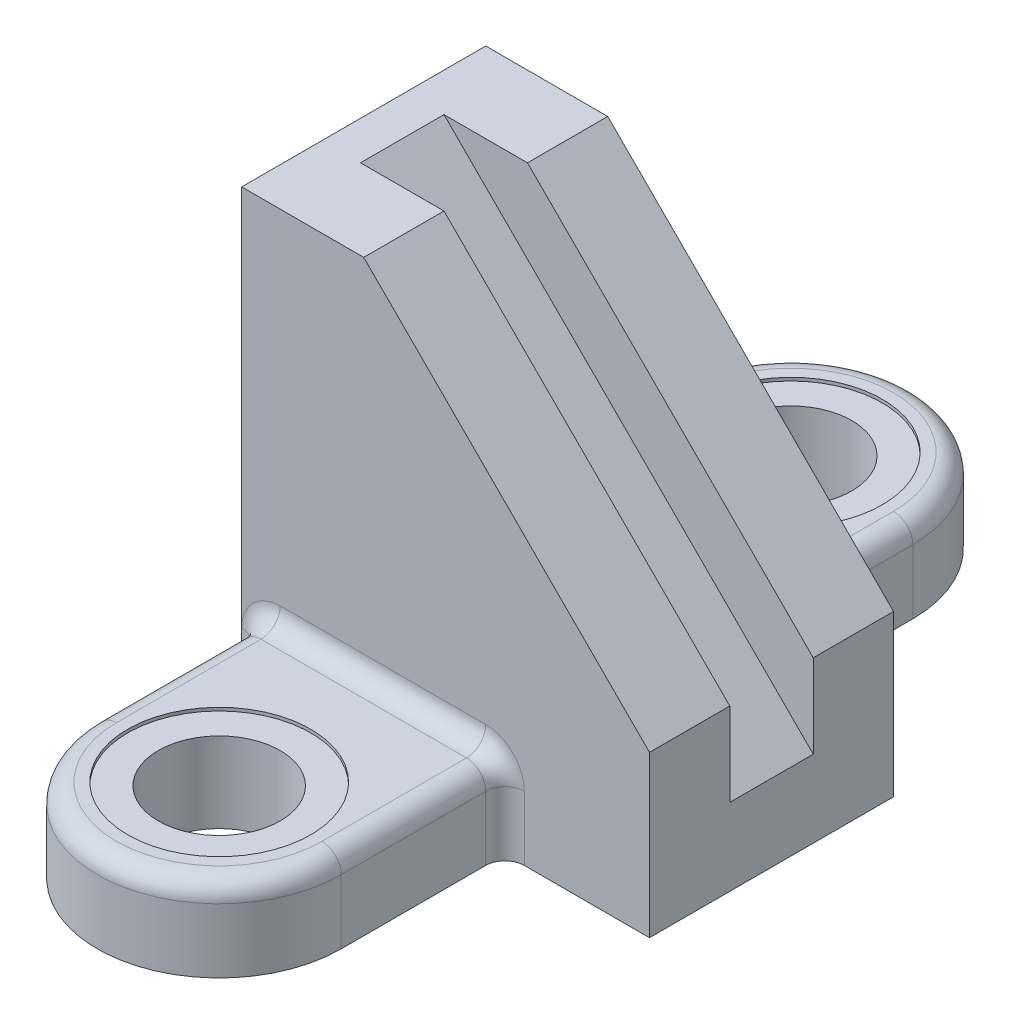
ISO-10303-21;
HEADER;
FILE_DESCRIPTION(('STEP AP214'),'2;1');
FILE_NAME('part.step','',(''),(''),'','','');
FILE_SCHEMA(('AUTOMOTIVE_DESIGN { 1 0 10303 214 1 1 1 1 }'));
ENDSEC;
DATA;
#1=APPLICATION_CONTEXT('core data for automotive mechanical design processes');
#2=APPLICATION_PROTOCOL_DEFINITION('international standard','automotive_design',2000,#1);
#3=PRODUCT_CONTEXT('',#1,'mechanical');
#4=PRODUCT('Part','Part','',(#3));
#5=PRODUCT_RELATED_PRODUCT_CATEGORY('part','',(#4));
#6=PRODUCT_DEFINITION_FORMATION('','',#4);
#7=PRODUCT_DEFINITION_CONTEXT('part definition',#1,'design');
#8=PRODUCT_DEFINITION('design','',#6,#7);
#9=PRODUCT_DEFINITION_SHAPE('','',#8);
#10=(LENGTH_UNIT() NAMED_UNIT(*) SI_UNIT(.MILLI.,.METRE.));
#11=(NAMED_UNIT(*) PLANE_ANGLE_UNIT() SI_UNIT($,.RADIAN.));
#12=(NAMED_UNIT(*) SI_UNIT($,.STERADIAN.) SOLID_ANGLE_UNIT());
#13=UNCERTAINTY_MEASURE_WITH_UNIT(LENGTH_MEASURE(1.E-05),#10,'distance_accuracy_value','');
#14=(GEOMETRIC_REPRESENTATION_CONTEXT(3) GLOBAL_UNCERTAINTY_ASSIGNED_CONTEXT((#13)) GLOBAL_UNIT_ASSIGNED_CONTEXT((#10,
#11,#12)) REPRESENTATION_CONTEXT('',''));
#15=CARTESIAN_POINT('',(0.,0.,0.));
#16=DIRECTION('',(0.,0.,1.));
#17=DIRECTION('',(1.,0.,0.));
#18=AXIS2_PLACEMENT_3D('',#15,#16,#17);
#19=CARTESIAN_POINT('',(0.,0.,38.));
#20=DIRECTION('',(0.,0.,1.));
#21=DIRECTION('',(1.,0.,0.));
#22=AXIS2_PLACEMENT_3D('',#19,#20,#21);
#23=PLANE('',#22);
#24=CARTESIAN_POINT('',(12.,20.,38.));
#25=DIRECTION('',(0.,0.,1.));
#26=DIRECTION('',(1.,0.,0.));
#27=AXIS2_PLACEMENT_3D('',#24,#25,#26);
#28=CIRCLE('',#27,12.);
#29=CARTESIAN_POINT('',(12.,32.,38.));
#30=VERTEX_POINT('',#29);
#31=CARTESIAN_POINT('',(0.,20.,38.));
#32=VERTEX_POINT('',#31);
#33=EDGE_CURVE('E362',#30,#32,#28,.T.);
#34=ORIENTED_EDGE('',*,*,#33,.F.);
#35=DIRECTION('',(1.,0.,0.));
#36=VECTOR('',#35,1.);
#37=CARTESIAN_POINT('',(82.,32.,38.));
#38=LINE('',#37,#36);
#39=CARTESIAN_POINT('',(76.,32.,38.));
#40=VERTEX_POINT('',#39);
#41=EDGE_CURVE('E360',#30,#40,#38,.T.);
#42=ORIENTED_EDGE('',*,*,#41,.T.);
#43=CARTESIAN_POINT('',(76.,20.,38.));
#44=DIRECTION('',(0.,0.,1.));
#45=DIRECTION('',(1.,0.,0.));
#46=AXIS2_PLACEMENT_3D('',#43,#44,#45);
#47=CIRCLE('',#46,12.);
#48=CARTESIAN_POINT('',(88.,20.,38.));
#49=VERTEX_POINT('',#48);
#50=EDGE_CURVE('E357',#49,#40,#47,.T.);
#51=ORIENTED_EDGE('',*,*,#50,.F.);
#52=DIRECTION('',(0.,-1.,0.));
#53=VECTOR('',#52,1.);
#54=CARTESIAN_POINT('',(88.,0.,38.));
#55=LINE('',#54,#53);
#56=CARTESIAN_POINT('',(88.,0.,38.));
#57=VERTEX_POINT('',#56);
#58=EDGE_CURVE('E355',#49,#57,#55,.T.);
#59=ORIENTED_EDGE('',*,*,#58,.T.);
#60=DIRECTION('',(1.,0.,0.));
#61=VECTOR('',#60,1.);
#62=CARTESIAN_POINT('',(0.,0.,38.));
#63=LINE('',#62,#61);
#64=CARTESIAN_POINT('',(127.,0.,38.));
#65=VERTEX_POINT('',#64);
#66=EDGE_CURVE('E296',#57,#65,#63,.T.);
#67=ORIENTED_EDGE('',*,*,#66,.T.);
#68=DIRECTION('',(0.,1.,0.));
#69=VECTOR('',#68,1.);
#70=CARTESIAN_POINT('',(127.,0.,38.));
#71=LINE('',#70,#69);
#72=CARTESIAN_POINT('',(127.,50.,38.));
#73=VERTEX_POINT('',#72);
#74=EDGE_CURVE('E299',#65,#73,#71,.T.);
#75=ORIENTED_EDGE('',*,*,#74,.T.);
#76=DIRECTION('',(-0.707106781186551,0.707106781186544,0.));
#77=VECTOR('',#76,1.);
#78=CARTESIAN_POINT('',(127.,50.,38.));
#79=LINE('',#78,#77);
#80=CARTESIAN_POINT('',(38.,138.999999999999,38.));
#81=VERTEX_POINT('',#80);
#82=EDGE_CURVE('E301',#73,#81,#79,.T.);
#83=ORIENTED_EDGE('',*,*,#82,.T.);
#84=DIRECTION('',(-1.,0.,0.));
#85=VECTOR('',#84,1.);
#86=CARTESIAN_POINT('',(38.,138.999999999999,38.));
#87=LINE('',#86,#85);
#88=CARTESIAN_POINT('',(0.,138.999999999999,38.));
#89=VERTEX_POINT('',#88);
#90=EDGE_CURVE('E303',#81,#89,#87,.T.);
#91=ORIENTED_EDGE('',*,*,#90,.T.);
#92=DIRECTION('',(0.,-1.,0.));
#93=VECTOR('',#92,1.);
#94=CARTESIAN_POINT('',(0.,138.999999999999,38.));
#95=LINE('',#94,#93);
#96=EDGE_CURVE('E293',#89,#32,#95,.T.);
#97=ORIENTED_EDGE('',*,*,#96,.T.);
#98=EDGE_LOOP('',(#34,#42,#51,#59,#67,#75,#83,#91,#97));
#99=FACE_BOUND('',#98,.T.);
#100=ADVANCED_FACE('F37',(#99),#23,.T.);
#101=CARTESIAN_POINT('',(0.,0.,-38.));
#102=DIRECTION('',(0.,0.,1.));
#103=DIRECTION('',(1.,0.,0.));
#104=AXIS2_PLACEMENT_3D('',#101,#102,#103);
#105=PLANE('',#104);
#106=CARTESIAN_POINT('',(12.,20.,-38.));
#107=DIRECTION('',(0.,0.,1.));
#108=DIRECTION('',(1.,0.,0.));
#109=AXIS2_PLACEMENT_3D('',#106,#107,#108);
#110=CIRCLE('',#109,12.);
#111=CARTESIAN_POINT('',(0.,20.,-38.));
#112=VERTEX_POINT('',#111);
#113=CARTESIAN_POINT('',(12.,32.,-38.));
#114=VERTEX_POINT('',#113);
#115=EDGE_CURVE('E344',#112,#114,#110,.F.);
#116=ORIENTED_EDGE('',*,*,#115,.F.);
#117=DIRECTION('',(0.,-1.,0.));
#118=VECTOR('',#117,1.);
#119=CARTESIAN_POINT('',(0.,138.999999999999,-38.));
#120=LINE('',#119,#118);
#121=CARTESIAN_POINT('',(0.,138.999999999999,-38.));
#122=VERTEX_POINT('',#121);
#123=EDGE_CURVE('E306',#122,#112,#120,.T.);
#124=ORIENTED_EDGE('',*,*,#123,.F.);
#125=DIRECTION('',(-1.,0.,0.));
#126=VECTOR('',#125,1.);
#127=CARTESIAN_POINT('',(38.,138.999999999999,-38.));
#128=LINE('',#127,#126);
#129=CARTESIAN_POINT('',(38.,138.999999999999,-38.));
#130=VERTEX_POINT('',#129);
#131=EDGE_CURVE('E317',#130,#122,#128,.T.);
#132=ORIENTED_EDGE('',*,*,#131,.F.);
#133=DIRECTION('',(-0.707106781186551,0.707106781186544,0.));
#134=VECTOR('',#133,1.);
#135=CARTESIAN_POINT('',(127.,50.,-38.));
#136=LINE('',#135,#134);
#137=CARTESIAN_POINT('',(127.,50.,-38.));
#138=VERTEX_POINT('',#137);
#139=EDGE_CURVE('E314',#138,#130,#136,.T.);
#140=ORIENTED_EDGE('',*,*,#139,.F.);
#141=DIRECTION('',(0.,1.,0.));
#142=VECTOR('',#141,1.);
#143=CARTESIAN_POINT('',(127.,0.,-38.));
#144=LINE('',#143,#142);
#145=CARTESIAN_POINT('',(127.,0.,-38.));
#146=VERTEX_POINT('',#145);
#147=EDGE_CURVE('E311',#146,#138,#144,.T.);
#148=ORIENTED_EDGE('',*,*,#147,.F.);
#149=DIRECTION('',(1.,0.,0.));
#150=VECTOR('',#149,1.);
#151=CARTESIAN_POINT('',(0.,0.,-38.));
#152=LINE('',#151,#150);
#153=CARTESIAN_POINT('',(88.,0.,-38.));
#154=VERTEX_POINT('',#153);
#155=EDGE_CURVE('E309',#154,#146,#152,.T.);
#156=ORIENTED_EDGE('',*,*,#155,.F.);
#157=DIRECTION('',(0.,-1.,0.));
#158=VECTOR('',#157,1.);
#159=CARTESIAN_POINT('',(88.,26.,-38.));
#160=LINE('',#159,#158);
#161=CARTESIAN_POINT('',(88.,20.,-38.));
#162=VERTEX_POINT('',#161);
#163=EDGE_CURVE('E340',#154,#162,#160,.F.);
#164=ORIENTED_EDGE('',*,*,#163,.T.);
#165=CARTESIAN_POINT('',(76.,20.,-38.));
#166=DIRECTION('',(0.,0.,1.));
#167=DIRECTION('',(1.,0.,0.));
#168=AXIS2_PLACEMENT_3D('',#165,#166,#167);
#169=CIRCLE('',#168,12.);
#170=CARTESIAN_POINT('',(76.,32.,-38.));
#171=VERTEX_POINT('',#170);
#172=EDGE_CURVE('E337',#171,#162,#169,.F.);
#173=ORIENTED_EDGE('',*,*,#172,.F.);
#174=DIRECTION('',(1.,0.,0.));
#175=VECTOR('',#174,1.);
#176=CARTESIAN_POINT('',(0.,32.,-38.));
#177=LINE('',#176,#175);
#178=EDGE_CURVE('E342',#171,#114,#177,.F.);
#179=ORIENTED_EDGE('',*,*,#178,.T.);
#180=EDGE_LOOP('',(#116,#124,#132,#140,#148,#156,#164,#173,#179));
#181=FACE_BOUND('',#180,.T.);
#182=ADVANCED_FACE('F522',(#181),#105,.F.);
#183=CARTESIAN_POINT('',(127.,50.,38.));
#184=DIRECTION('',(-0.707106781186544,-0.707106781186551,0.));
#185=DIRECTION('',(0.707106781186551,-0.707106781186544,0.));
#186=AXIS2_PLACEMENT_3D('',#183,#184,#185);
#187=PLANE('',#186);
#188=DIRECTION('',(0.,0.,-1.));
#189=VECTOR('',#188,1.);
#190=CARTESIAN_POINT('',(38.,138.999999999999,38.));
#191=LINE('',#190,#189);
#192=CARTESIAN_POINT('',(38.,138.999999999999,-13.));
#193=VERTEX_POINT('',#192);
#194=EDGE_CURVE('E321',#193,#130,#191,.T.);
#195=ORIENTED_EDGE('',*,*,#194,.F.);
#196=DIRECTION('',(0.707106781186551,-0.707106781186544,0.));
#197=VECTOR('',#196,1.);
#198=CARTESIAN_POINT('',(127.,50.,-13.));
#199=LINE('',#198,#197);
#200=CARTESIAN_POINT('',(127.,50.,-13.));
#201=VERTEX_POINT('',#200);
#202=EDGE_CURVE('E283',#193,#201,#199,.T.);
#203=ORIENTED_EDGE('',*,*,#202,.T.);
#204=DIRECTION('',(0.,0.,-1.));
#205=VECTOR('',#204,1.);
#206=CARTESIAN_POINT('',(127.,50.,38.));
#207=LINE('',#206,#205);
#208=EDGE_CURVE('E325',#201,#138,#207,.T.);
#209=ORIENTED_EDGE('',*,*,#208,.T.);
#210=ORIENTED_EDGE('',*,*,#139,.T.);
#211=EDGE_LOOP('',(#195,#203,#209,#210));
#212=FACE_BOUND('',#211,.T.);
#213=ADVANCED_FACE('F527',(#212),#187,.F.);
#214=CARTESIAN_POINT('',(0.,138.999999999999,38.));
#215=DIRECTION('',(1.,0.,0.));
#216=DIRECTION('',(0.,0.,-1.));
#217=AXIS2_PLACEMENT_3D('',#214,#215,#216);
#218=PLANE('',#217);
#219=ORIENTED_EDGE('',*,*,#123,.T.);
#220=CARTESIAN_POINT('',(0.,0.,-38.));
#221=VERTEX_POINT('',#220);
#222=EDGE_CURVE('E292',#112,#221,#120,.T.);
#223=ORIENTED_EDGE('',*,*,#222,.T.);
#224=DIRECTION('',(0.,0.,-1.));
#225=VECTOR('',#224,1.);
#226=CARTESIAN_POINT('',(0.,0.,38.));
#227=LINE('',#226,#225);
#228=CARTESIAN_POINT('',(0.,0.,38.));
#229=VERTEX_POINT('',#228);
#230=EDGE_CURVE('E332',#229,#221,#227,.T.);
#231=ORIENTED_EDGE('',*,*,#230,.F.);
#232=EDGE_CURVE('E297',#32,#229,#95,.T.);
#233=ORIENTED_EDGE('',*,*,#232,.F.);
#234=ORIENTED_EDGE('',*,*,#96,.F.);
#235=DIRECTION('',(0.,0.,-1.));
#236=VECTOR('',#235,1.);
#237=CARTESIAN_POINT('',(0.,138.999999999999,38.));
#238=LINE('',#237,#236);
#239=EDGE_CURVE('E305',#89,#122,#238,.T.);
#240=ORIENTED_EDGE('',*,*,#239,.T.);
#241=EDGE_LOOP('',(#219,#223,#231,#233,#234,#240));
#242=FACE_BOUND('',#241,.T.);
#243=ADVANCED_FACE('F471',(#242),#218,.F.);
#244=CARTESIAN_POINT('',(0.,0.,38.));
#245=DIRECTION('',(0.,1.,0.));
#246=DIRECTION('',(0.,0.,1.));
#247=AXIS2_PLACEMENT_3D('',#244,#245,#246);
#248=PLANE('',#247);
#249=CARTESIAN_POINT('',(44.,0.,-89.));
#250=DIRECTION('',(0.,1.,0.));
#251=DIRECTION('',(0.,0.,1.));
#252=AXIS2_PLACEMENT_3D('',#249,#250,#251);
#253=CIRCLE('',#252,19.);
#254=CARTESIAN_POINT('',(44.,0.,-70.));
#255=VERTEX_POINT('',#254);
#256=EDGE_CURVE('E234',#255,#255,#253,.T.);
#257=ORIENTED_EDGE('',*,*,#256,.T.);
#258=EDGE_LOOP('',(#257));
#259=FACE_BOUND('',#258,.T.);
#260=CARTESIAN_POINT('',(44.,0.,89.));
#261=DIRECTION('',(0.,1.,0.));
#262=DIRECTION('',(0.,0.,1.));
#263=AXIS2_PLACEMENT_3D('',#260,#261,#262);
#264=CIRCLE('',#263,19.);
#265=CARTESIAN_POINT('',(44.,0.,108.));
#266=VERTEX_POINT('',#265);
#267=EDGE_CURVE('E252',#266,#266,#264,.T.);
#268=ORIENTED_EDGE('',*,*,#267,.T.);
#269=EDGE_LOOP('',(#268));
#270=FACE_BOUND('',#269,.T.);
#271=ORIENTED_EDGE('',*,*,#230,.T.);
#272=CARTESIAN_POINT('',(0.,0.,-44.));
#273=DIRECTION('',(0.,1.,0.));
#274=DIRECTION('',(0.,0.,1.));
#275=AXIS2_PLACEMENT_3D('',#272,#273,#274);
#276=CIRCLE('',#275,6.);
#277=CARTESIAN_POINT('',(6.,0.,-44.));
#278=VERTEX_POINT('',#277);
#279=EDGE_CURVE('E233',#221,#278,#276,.T.);
#280=ORIENTED_EDGE('',*,*,#279,.T.);
#281=DIRECTION('',(0.,0.,1.));
#282=VECTOR('',#281,1.);
#283=CARTESIAN_POINT('',(6.,0.,-38.));
#284=LINE('',#283,#282);
#285=CARTESIAN_POINT('',(5.99999999999999,0.,-89.));
#286=VERTEX_POINT('',#285);
#287=EDGE_CURVE('E215',#286,#278,#284,.T.);
#288=ORIENTED_EDGE('',*,*,#287,.F.);
#289=CARTESIAN_POINT('',(44.,0.,-89.));
#290=DIRECTION('',(0.,1.,0.));
#291=DIRECTION('',(0.,0.,-1.));
#292=AXIS2_PLACEMENT_3D('',#289,#290,#291);
#293=CIRCLE('',#292,38.);
#294=CARTESIAN_POINT('',(82.,0.,-89.));
#295=VERTEX_POINT('',#294);
#296=EDGE_CURVE('E226',#295,#286,#293,.T.);
#297=ORIENTED_EDGE('',*,*,#296,.F.);
#298=DIRECTION('',(0.,0.,-1.));
#299=VECTOR('',#298,1.);
#300=CARTESIAN_POINT('',(82.,0.,-38.));
#301=LINE('',#300,#299);
#302=CARTESIAN_POINT('',(82.,0.,-44.));
#303=VERTEX_POINT('',#302);
#304=EDGE_CURVE('E222',#303,#295,#301,.T.);
#305=ORIENTED_EDGE('',*,*,#304,.F.);
#306=CARTESIAN_POINT('',(88.,0.,-44.));
#307=DIRECTION('',(0.,1.,0.));
#308=DIRECTION('',(0.,0.,1.));
#309=AXIS2_PLACEMENT_3D('',#306,#307,#308);
#310=CIRCLE('',#309,6.);
#311=EDGE_CURVE('E46',#303,#154,#310,.T.);
#312=ORIENTED_EDGE('',*,*,#311,.T.);
#313=ORIENTED_EDGE('',*,*,#155,.T.);
#314=DIRECTION('',(0.,0.,-1.));
#315=VECTOR('',#314,1.);
#316=CARTESIAN_POINT('',(127.,0.,38.));
#317=LINE('',#316,#315);
#318=EDGE_CURVE('E329',#65,#146,#317,.T.);
#319=ORIENTED_EDGE('',*,*,#318,.F.);
#320=ORIENTED_EDGE('',*,*,#66,.F.);
#321=CARTESIAN_POINT('',(88.,0.,44.));
#322=DIRECTION('',(0.,1.,0.));
#323=DIRECTION('',(0.,0.,1.));
#324=AXIS2_PLACEMENT_3D('',#321,#322,#323);
#325=CIRCLE('',#324,6.);
#326=CARTESIAN_POINT('',(82.,0.,44.));
#327=VERTEX_POINT('',#326);
#328=EDGE_CURVE('E11',#57,#327,#325,.T.);
#329=ORIENTED_EDGE('',*,*,#328,.T.);
#330=DIRECTION('',(0.,0.,1.));
#331=VECTOR('',#330,1.);
#332=CARTESIAN_POINT('',(82.,0.,38.));
#333=LINE('',#332,#331);
#334=CARTESIAN_POINT('',(82.,0.,89.));
#335=VERTEX_POINT('',#334);
#336=EDGE_CURVE('E258',#327,#335,#333,.T.);
#337=ORIENTED_EDGE('',*,*,#336,.T.);
#338=CARTESIAN_POINT('',(44.,0.,89.));
#339=DIRECTION('',(0.,-1.,0.));
#340=DIRECTION('',(0.,0.,1.));
#341=AXIS2_PLACEMENT_3D('',#338,#339,#340);
#342=CIRCLE('',#341,38.);
#343=CARTESIAN_POINT('',(5.99999999999999,0.,89.));
#344=VERTEX_POINT('',#343);
#345=EDGE_CURVE('E260',#335,#344,#342,.T.);
#346=ORIENTED_EDGE('',*,*,#345,.T.);
#347=DIRECTION('',(0.,0.,-1.));
#348=VECTOR('',#347,1.);
#349=CARTESIAN_POINT('',(6.,0.,38.));
#350=LINE('',#349,#348);
#351=CARTESIAN_POINT('',(6.,0.,44.));
#352=VERTEX_POINT('',#351);
#353=EDGE_CURVE('E255',#344,#352,#350,.T.);
#354=ORIENTED_EDGE('',*,*,#353,.T.);
#355=CARTESIAN_POINT('',(0.,0.,44.));
#356=DIRECTION('',(0.,1.,0.));
#357=DIRECTION('',(0.,0.,1.));
#358=AXIS2_PLACEMENT_3D('',#355,#356,#357);
#359=CIRCLE('',#358,6.);
#360=EDGE_CURVE('E395',#352,#229,#359,.T.);
#361=ORIENTED_EDGE('',*,*,#360,.T.);
#362=EDGE_LOOP('',(#271,#280,#288,#297,#305,#312,#313,#319,#320,#329,#337,#346,#354,#361));
#363=FACE_BOUND('',#362,.T.);
#364=ADVANCED_FACE('F232',(#259,#270,#363),#248,.F.);
#365=CARTESIAN_POINT('',(127.,0.,38.));
#366=DIRECTION('',(-1.,0.,0.));
#367=DIRECTION('',(0.,0.,1.));
#368=AXIS2_PLACEMENT_3D('',#365,#366,#367);
#369=PLANE('',#368);
#370=ORIENTED_EDGE('',*,*,#208,.F.);
#371=DIRECTION('',(0.,-1.,0.));
#372=VECTOR('',#371,1.);
#373=CARTESIAN_POINT('',(127.,0.,-13.));
#374=LINE('',#373,#372);
#375=CARTESIAN_POINT('',(127.,24.0000000000003,-13.));
#376=VERTEX_POINT('',#375);
#377=EDGE_CURVE('E286',#201,#376,#374,.T.);
#378=ORIENTED_EDGE('',*,*,#377,.T.);
#379=DIRECTION('',(0.,0.,1.));
#380=VECTOR('',#379,1.);
#381=CARTESIAN_POINT('',(127.,24.0000000000003,38.));
#382=LINE('',#381,#380);
#383=CARTESIAN_POINT('',(127.,24.0000000000003,13.));
#384=VERTEX_POINT('',#383);
#385=EDGE_CURVE('E289',#376,#384,#382,.T.);
#386=ORIENTED_EDGE('',*,*,#385,.T.);
#387=DIRECTION('',(0.,1.,0.));
#388=VECTOR('',#387,1.);
#389=CARTESIAN_POINT('',(127.,0.,13.));
#390=LINE('',#389,#388);
#391=CARTESIAN_POINT('',(127.,50.,13.));
#392=VERTEX_POINT('',#391);
#393=EDGE_CURVE('E280',#384,#392,#390,.T.);
#394=ORIENTED_EDGE('',*,*,#393,.T.);
#395=EDGE_CURVE('E326',#73,#392,#207,.T.);
#396=ORIENTED_EDGE('',*,*,#395,.F.);
#397=ORIENTED_EDGE('',*,*,#74,.F.);
#398=ORIENTED_EDGE('',*,*,#318,.T.);
#399=ORIENTED_EDGE('',*,*,#147,.T.);
#400=EDGE_LOOP('',(#370,#378,#386,#394,#396,#397,#398,#399));
#401=FACE_BOUND('',#400,.T.);
#402=ADVANCED_FACE('F456',(#401),#369,.F.);
#403=ORIENTED_EDGE('',*,*,#395,.T.);
#404=DIRECTION('',(-0.707106781186551,0.707106781186544,0.));
#405=VECTOR('',#404,1.);
#406=CARTESIAN_POINT('',(127.,50.,13.));
#407=LINE('',#406,#405);
#408=CARTESIAN_POINT('',(38.,138.999999999999,13.));
#409=VERTEX_POINT('',#408);
#410=EDGE_CURVE('E275',#392,#409,#407,.T.);
#411=ORIENTED_EDGE('',*,*,#410,.T.);
#412=EDGE_CURVE('E322',#81,#409,#191,.T.);
#413=ORIENTED_EDGE('',*,*,#412,.F.);
#414=ORIENTED_EDGE('',*,*,#82,.F.);
#415=EDGE_LOOP('',(#403,#411,#413,#414));
#416=FACE_BOUND('',#415,.T.);
#417=ADVANCED_FACE('F462',(#416),#187,.F.);
#418=CARTESIAN_POINT('',(38.,138.999999999999,38.));
#419=DIRECTION('',(0.,-1.,0.));
#420=DIRECTION('',(0.,0.,-1.));
#421=AXIS2_PLACEMENT_3D('',#418,#419,#420);
#422=PLANE('',#421);
#423=DIRECTION('',(0.,0.,1.));
#424=VECTOR('',#423,1.);
#425=CARTESIAN_POINT('',(12.,138.999999999999,13.));
#426=LINE('',#425,#424);
#427=CARTESIAN_POINT('',(12.,138.999999999999,-13.));
#428=VERTEX_POINT('',#427);
#429=CARTESIAN_POINT('',(12.,138.999999999999,13.));
#430=VERTEX_POINT('',#429);
#431=EDGE_CURVE('E266',#428,#430,#426,.T.);
#432=ORIENTED_EDGE('',*,*,#431,.F.);
#433=DIRECTION('',(1.,0.,0.));
#434=VECTOR('',#433,1.);
#435=CARTESIAN_POINT('',(38.,138.999999999999,-13.));
#436=LINE('',#435,#434);
#437=EDGE_CURVE('E334',#428,#193,#436,.T.);
#438=ORIENTED_EDGE('',*,*,#437,.T.);
#439=ORIENTED_EDGE('',*,*,#194,.T.);
#440=ORIENTED_EDGE('',*,*,#131,.T.);
#441=ORIENTED_EDGE('',*,*,#239,.F.);
#442=ORIENTED_EDGE('',*,*,#90,.F.);
#443=ORIENTED_EDGE('',*,*,#412,.T.);
#444=DIRECTION('',(1.,0.,0.));
#445=VECTOR('',#444,1.);
#446=CARTESIAN_POINT('',(64.,138.999999999999,13.));
#447=LINE('',#446,#445);
#448=EDGE_CURVE('E270',#430,#409,#447,.T.);
#449=ORIENTED_EDGE('',*,*,#448,.F.);
#450=EDGE_LOOP('',(#432,#438,#439,#440,#441,#442,#443,#449));
#451=FACE_BOUND('',#450,.T.);
#452=ADVANCED_FACE('F466',(#451),#422,.F.);
#453=CARTESIAN_POINT('',(139.,12.0000000000003,13.));
#454=DIRECTION('',(-0.707106781186544,-0.707106781186551,0.));
#455=DIRECTION('',(0.707106781186551,-0.707106781186544,0.));
#456=AXIS2_PLACEMENT_3D('',#453,#454,#455);
#457=PLANE('',#456);
#458=DIRECTION('',(-0.707106781186551,0.707106781186544,0.));
#459=VECTOR('',#458,1.);
#460=CARTESIAN_POINT('',(139.,12.0000000000003,-13.));
#461=LINE('',#460,#459);
#462=EDGE_CURVE('E273',#376,#428,#461,.T.);
#463=ORIENTED_EDGE('',*,*,#462,.T.);
#464=ORIENTED_EDGE('',*,*,#431,.T.);
#465=DIRECTION('',(-0.707106781186551,0.707106781186544,0.));
#466=VECTOR('',#465,1.);
#467=CARTESIAN_POINT('',(139.,12.0000000000003,13.));
#468=LINE('',#467,#466);
#469=EDGE_CURVE('E272',#384,#430,#468,.T.);
#470=ORIENTED_EDGE('',*,*,#469,.F.);
#471=ORIENTED_EDGE('',*,*,#385,.F.);
#472=EDGE_LOOP('',(#463,#464,#470,#471));
#473=FACE_BOUND('',#472,.T.);
#474=ADVANCED_FACE('F531',(#473),#457,.F.);
#475=CARTESIAN_POINT('',(191.,12.0000000000003,-13.));
#476=DIRECTION('',(0.,0.,-1.));
#477=DIRECTION('',(0.,1.,0.));
#478=AXIS2_PLACEMENT_3D('',#475,#476,#477);
#479=PLANE('',#478);
#480=ORIENTED_EDGE('',*,*,#202,.F.);
#481=ORIENTED_EDGE('',*,*,#437,.F.);
#482=ORIENTED_EDGE('',*,*,#462,.F.);
#483=ORIENTED_EDGE('',*,*,#377,.F.);
#484=EDGE_LOOP('',(#480,#481,#482,#483));
#485=FACE_BOUND('',#484,.T.);
#486=ADVANCED_FACE('F850',(#485),#479,.F.);
#487=CARTESIAN_POINT('',(191.,12.0000000000003,13.));
#488=DIRECTION('',(0.,0.,1.));
#489=DIRECTION('',(0.,-1.,0.));
#490=AXIS2_PLACEMENT_3D('',#487,#488,#489);
#491=PLANE('',#490);
#492=ORIENTED_EDGE('',*,*,#469,.T.);
#493=ORIENTED_EDGE('',*,*,#448,.T.);
#494=ORIENTED_EDGE('',*,*,#410,.F.);
#495=ORIENTED_EDGE('',*,*,#393,.F.);
#496=EDGE_LOOP('',(#492,#493,#494,#495));
#497=FACE_BOUND('',#496,.T.);
#498=ADVANCED_FACE('F725',(#497),#491,.F.);
#499=CARTESIAN_POINT('',(6.,26.,38.));
#500=DIRECTION('',(-1.,0.,0.));
#501=DIRECTION('',(0.,0.,1.));
#502=AXIS2_PLACEMENT_3D('',#499,#500,#501);
#503=PLANE('',#502);
#504=DIRECTION('',(0.,0.,-1.));
#505=VECTOR('',#504,1.);
#506=CARTESIAN_POINT('',(6.,20.,38.));
#507=LINE('',#506,#505);
#508=CARTESIAN_POINT('',(5.99999999999999,20.,89.));
#509=VERTEX_POINT('',#508);
#510=CARTESIAN_POINT('',(6.,20.,44.));
#511=VERTEX_POINT('',#510);
#512=EDGE_CURVE('E350',#509,#511,#507,.T.);
#513=ORIENTED_EDGE('',*,*,#512,.T.);
#514=DIRECTION('',(0.,-1.,0.));
#515=VECTOR('',#514,1.);
#516=CARTESIAN_POINT('',(6.,0.,44.));
#517=LINE('',#516,#515);
#518=EDGE_CURVE('E352',#511,#352,#517,.T.);
#519=ORIENTED_EDGE('',*,*,#518,.T.);
#520=ORIENTED_EDGE('',*,*,#353,.F.);
#521=DIRECTION('',(0.,-1.,0.));
#522=VECTOR('',#521,1.);
#523=CARTESIAN_POINT('',(5.99999999999999,26.,89.));
#524=LINE('',#523,#522);
#525=EDGE_CURVE('E264',#509,#344,#524,.T.);
#526=ORIENTED_EDGE('',*,*,#525,.F.);
#527=EDGE_LOOP('',(#513,#519,#520,#526));
#528=FACE_BOUND('',#527,.T.);
#529=ADVANCED_FACE('F484',(#528),#503,.T.);
#530=CARTESIAN_POINT('',(44.,26.,89.));
#531=DIRECTION('',(0.,-1.,0.));
#532=DIRECTION('',(0.,0.,-1.));
#533=AXIS2_PLACEMENT_3D('',#530,#531,#532);
#534=CYLINDRICAL_SURFACE('',#533,38.);
#535=DIRECTION('',(0.,-1.,0.));
#536=VECTOR('',#535,1.);
#537=CARTESIAN_POINT('',(82.,26.,89.));
#538=LINE('',#537,#536);
#539=CARTESIAN_POINT('',(82.,20.,89.));
#540=VERTEX_POINT('',#539);
#541=EDGE_CURVE('E263',#540,#335,#538,.T.);
#542=ORIENTED_EDGE('',*,*,#541,.F.);
#543=CARTESIAN_POINT('',(44.,20.,89.));
#544=DIRECTION('',(0.,1.,0.));
#545=DIRECTION('',(0.,0.,1.));
#546=AXIS2_PLACEMENT_3D('',#543,#544,#545);
#547=CIRCLE('',#546,38.);
#548=EDGE_CURVE('E385',#540,#509,#547,.F.);
#549=ORIENTED_EDGE('',*,*,#548,.T.);
#550=ORIENTED_EDGE('',*,*,#525,.T.);
#551=ORIENTED_EDGE('',*,*,#345,.F.);
#552=EDGE_LOOP('',(#542,#549,#550,#551));
#553=FACE_BOUND('',#552,.T.);
#554=ADVANCED_FACE('F491',(#553),#534,.T.);
#555=CARTESIAN_POINT('',(82.,26.,38.));
#556=DIRECTION('',(1.,0.,0.));
#557=DIRECTION('',(0.,0.,-1.));
#558=AXIS2_PLACEMENT_3D('',#555,#556,#557);
#559=PLANE('',#558);
#560=DIRECTION('',(0.,-1.,0.));
#561=VECTOR('',#560,1.);
#562=CARTESIAN_POINT('',(82.,26.,44.));
#563=LINE('',#562,#561);
#564=CARTESIAN_POINT('',(82.,20.,44.));
#565=VERTEX_POINT('',#564);
#566=EDGE_CURVE('E54',#327,#565,#563,.F.);
#567=ORIENTED_EDGE('',*,*,#566,.T.);
#568=DIRECTION('',(0.,0.,1.));
#569=VECTOR('',#568,1.);
#570=CARTESIAN_POINT('',(82.,20.,38.));
#571=LINE('',#570,#569);
#572=EDGE_CURVE('E392',#565,#540,#571,.T.);
#573=ORIENTED_EDGE('',*,*,#572,.T.);
#574=ORIENTED_EDGE('',*,*,#541,.T.);
#575=ORIENTED_EDGE('',*,*,#336,.F.);
#576=EDGE_LOOP('',(#567,#573,#574,#575));
#577=FACE_BOUND('',#576,.T.);
#578=ADVANCED_FACE('F510',(#577),#559,.T.);
#579=CARTESIAN_POINT('',(44.,26.,89.));
#580=DIRECTION('',(0.,1.,0.));
#581=DIRECTION('',(0.,0.,1.));
#582=AXIS2_PLACEMENT_3D('',#579,#580,#581);
#583=PLANE('',#582);
#584=DIRECTION('',(0.,0.,1.));
#585=VECTOR('',#584,1.);
#586=CARTESIAN_POINT('',(76.,26.,89.));
#587=LINE('',#586,#585);
#588=CARTESIAN_POINT('',(76.,26.,89.));
#589=VERTEX_POINT('',#588);
#590=CARTESIAN_POINT('',(76.,26.,44.));
#591=VERTEX_POINT('',#590);
#592=EDGE_CURVE('E374',#589,#591,#587,.F.);
#593=ORIENTED_EDGE('',*,*,#592,.T.);
#594=DIRECTION('',(1.,0.,0.));
#595=VECTOR('',#594,1.);
#596=CARTESIAN_POINT('',(6.,26.,44.));
#597=LINE('',#596,#595);
#598=CARTESIAN_POINT('',(12.,26.,44.));
#599=VERTEX_POINT('',#598);
#600=EDGE_CURVE('E380',#591,#599,#597,.F.);
#601=ORIENTED_EDGE('',*,*,#600,.T.);
#602=DIRECTION('',(0.,0.,-1.));
#603=VECTOR('',#602,1.);
#604=CARTESIAN_POINT('',(12.,26.,89.));
#605=LINE('',#604,#603);
#606=CARTESIAN_POINT('',(12.,26.,89.));
#607=VERTEX_POINT('',#606);
#608=EDGE_CURVE('E378',#599,#607,#605,.F.);
#609=ORIENTED_EDGE('',*,*,#608,.T.);
#610=CARTESIAN_POINT('',(44.,26.,89.));
#611=DIRECTION('',(0.,1.,0.));
#612=DIRECTION('',(0.,0.,1.));
#613=AXIS2_PLACEMENT_3D('',#610,#611,#612);
#614=CIRCLE('',#613,32.);
#615=EDGE_CURVE('E376',#607,#589,#614,.T.);
#616=ORIENTED_EDGE('',*,*,#615,.T.);
#617=EDGE_LOOP('',(#593,#601,#609,#616));
#618=FACE_BOUND('',#617,.T.);
#619=CARTESIAN_POINT('',(44.,26.,89.));
#620=DIRECTION('',(0.,1.,0.));
#621=DIRECTION('',(0.,0.,1.));
#622=AXIS2_PLACEMENT_3D('',#619,#620,#621);
#623=CIRCLE('',#622,28.5);
#624=CARTESIAN_POINT('',(44.,26.,117.5));
#625=VERTEX_POINT('',#624);
#626=EDGE_CURVE('E242',#625,#625,#623,.T.);
#627=ORIENTED_EDGE('',*,*,#626,.F.);
#628=EDGE_LOOP('',(#627));
#629=FACE_BOUND('',#628,.T.);
#630=ADVANCED_FACE('F505',(#618,#629),#583,.T.);
#631=CARTESIAN_POINT('',(44.,26.,89.));
#632=DIRECTION('',(0.,1.,0.));
#633=DIRECTION('',(0.,0.,1.));
#634=AXIS2_PLACEMENT_3D('',#631,#632,#633);
#635=CYLINDRICAL_SURFACE('',#634,19.);
#636=ORIENTED_EDGE('',*,*,#267,.F.);
#637=EDGE_LOOP('',(#636));
#638=FACE_BOUND('',#637,.T.);
#639=CARTESIAN_POINT('',(44.,25.,89.));
#640=DIRECTION('',(0.,1.,0.));
#641=DIRECTION('',(0.,0.,1.));
#642=AXIS2_PLACEMENT_3D('',#639,#640,#641);
#643=CIRCLE('',#642,19.);
#644=CARTESIAN_POINT('',(44.,25.,108.));
#645=VERTEX_POINT('',#644);
#646=EDGE_CURVE('E249',#645,#645,#643,.T.);
#647=ORIENTED_EDGE('',*,*,#646,.T.);
#648=EDGE_LOOP('',(#647));
#649=FACE_BOUND('',#648,.T.);
#650=ADVANCED_FACE('F517',(#638,#649),#635,.F.);
#651=CARTESIAN_POINT('',(63.,25.,89.));
#652=DIRECTION('',(0.,-1.,0.));
#653=DIRECTION('',(0.,0.,-1.));
#654=AXIS2_PLACEMENT_3D('',#651,#652,#653);
#655=PLANE('',#654);
#656=ORIENTED_EDGE('',*,*,#646,.F.);
#657=EDGE_LOOP('',(#656));
#658=FACE_BOUND('',#657,.T.);
#659=CARTESIAN_POINT('',(44.,25.,89.));
#660=DIRECTION('',(0.,1.,0.));
#661=DIRECTION('',(0.,0.,1.));
#662=AXIS2_PLACEMENT_3D('',#659,#660,#661);
#663=CIRCLE('',#662,28.5);
#664=CARTESIAN_POINT('',(44.,25.,117.5));
#665=VERTEX_POINT('',#664);
#666=EDGE_CURVE('E246',#665,#665,#663,.T.);
#667=ORIENTED_EDGE('',*,*,#666,.T.);
#668=EDGE_LOOP('',(#667));
#669=FACE_BOUND('',#668,.T.);
#670=ADVANCED_FACE('F686',(#658,#669),#655,.F.);
#671=CARTESIAN_POINT('',(44.,26.,89.));
#672=DIRECTION('',(0.,1.,0.));
#673=DIRECTION('',(0.,0.,1.));
#674=AXIS2_PLACEMENT_3D('',#671,#672,#673);
#675=CYLINDRICAL_SURFACE('',#674,28.5);
#676=ORIENTED_EDGE('',*,*,#666,.F.);
#677=EDGE_LOOP('',(#676));
#678=FACE_BOUND('',#677,.T.);
#679=ORIENTED_EDGE('',*,*,#626,.T.);
#680=EDGE_LOOP('',(#679));
#681=FACE_BOUND('',#680,.T.);
#682=ADVANCED_FACE('F679',(#678,#681),#675,.F.);
#683=CARTESIAN_POINT('',(6.,26.,-38.));
#684=DIRECTION('',(1.,0.,0.));
#685=DIRECTION('',(0.,0.,-1.));
#686=AXIS2_PLACEMENT_3D('',#683,#684,#685);
#687=PLANE('',#686);
#688=ORIENTED_EDGE('',*,*,#287,.T.);
#689=DIRECTION('',(0.,-1.,0.));
#690=VECTOR('',#689,1.);
#691=CARTESIAN_POINT('',(6.,26.,-44.));
#692=LINE('',#691,#690);
#693=CARTESIAN_POINT('',(6.,20.,-44.));
#694=VERTEX_POINT('',#693);
#695=EDGE_CURVE('E348',#278,#694,#692,.F.);
#696=ORIENTED_EDGE('',*,*,#695,.T.);
#697=DIRECTION('',(0.,0.,1.));
#698=VECTOR('',#697,1.);
#699=CARTESIAN_POINT('',(6.,20.,-89.));
#700=LINE('',#699,#698);
#701=CARTESIAN_POINT('',(5.99999999999999,20.,-89.));
#702=VERTEX_POINT('',#701);
#703=EDGE_CURVE('E218',#694,#702,#700,.F.);
#704=ORIENTED_EDGE('',*,*,#703,.T.);
#705=DIRECTION('',(0.,-1.,0.));
#706=VECTOR('',#705,1.);
#707=CARTESIAN_POINT('',(5.99999999999999,26.,-89.));
#708=LINE('',#707,#706);
#709=EDGE_CURVE('E211',#702,#286,#708,.T.);
#710=ORIENTED_EDGE('',*,*,#709,.T.);
#711=EDGE_LOOP('',(#688,#696,#704,#710));
#712=FACE_BOUND('',#711,.T.);
#713=ADVANCED_FACE('F213',(#712),#687,.F.);
#714=CARTESIAN_POINT('',(82.,26.,-38.));
#715=DIRECTION('',(-1.,0.,0.));
#716=DIRECTION('',(0.,0.,1.));
#717=AXIS2_PLACEMENT_3D('',#714,#715,#716);
#718=PLANE('',#717);
#719=DIRECTION('',(0.,-1.,0.));
#720=VECTOR('',#719,1.);
#721=CARTESIAN_POINT('',(82.,26.,-89.));
#722=LINE('',#721,#720);
#723=CARTESIAN_POINT('',(82.,20.,-89.));
#724=VERTEX_POINT('',#723);
#725=EDGE_CURVE('E221',#724,#295,#722,.T.);
#726=ORIENTED_EDGE('',*,*,#725,.F.);
#727=DIRECTION('',(0.,0.,-1.));
#728=VECTOR('',#727,1.);
#729=CARTESIAN_POINT('',(82.,20.,-38.));
#730=LINE('',#729,#728);
#731=CARTESIAN_POINT('',(82.,20.,-44.));
#732=VERTEX_POINT('',#731);
#733=EDGE_CURVE('E389',#724,#732,#730,.F.);
#734=ORIENTED_EDGE('',*,*,#733,.T.);
#735=DIRECTION('',(0.,-1.,0.));
#736=VECTOR('',#735,1.);
#737=CARTESIAN_POINT('',(82.,0.,-44.));
#738=LINE('',#737,#736);
#739=EDGE_CURVE('E387',#732,#303,#738,.T.);
#740=ORIENTED_EDGE('',*,*,#739,.T.);
#741=ORIENTED_EDGE('',*,*,#304,.T.);
#742=EDGE_LOOP('',(#726,#734,#740,#741));
#743=FACE_BOUND('',#742,.T.);
#744=ADVANCED_FACE('F665',(#743),#718,.F.);
#745=CARTESIAN_POINT('',(44.,26.,-89.));
#746=DIRECTION('',(0.,-1.,0.));
#747=DIRECTION('',(0.,0.,-1.));
#748=AXIS2_PLACEMENT_3D('',#745,#746,#747);
#749=CYLINDRICAL_SURFACE('',#748,38.);
#750=ORIENTED_EDGE('',*,*,#709,.F.);
#751=CARTESIAN_POINT('',(44.,20.,-89.));
#752=DIRECTION('',(0.,1.,0.));
#753=DIRECTION('',(0.,0.,1.));
#754=AXIS2_PLACEMENT_3D('',#751,#752,#753);
#755=CIRCLE('',#754,38.);
#756=EDGE_CURVE('E383',#702,#724,#755,.F.);
#757=ORIENTED_EDGE('',*,*,#756,.T.);
#758=ORIENTED_EDGE('',*,*,#725,.T.);
#759=ORIENTED_EDGE('',*,*,#296,.T.);
#760=EDGE_LOOP('',(#750,#757,#758,#759));
#761=FACE_BOUND('',#760,.T.);
#762=ADVANCED_FACE('F227',(#761),#749,.T.);
#763=CARTESIAN_POINT('',(44.,26.,-89.));
#764=DIRECTION('',(0.,1.,0.));
#765=DIRECTION('',(0.,0.,-1.));
#766=AXIS2_PLACEMENT_3D('',#763,#764,#765);
#767=PLANE('',#766);
#768=DIRECTION('',(0.,0.,1.));
#769=VECTOR('',#768,1.);
#770=CARTESIAN_POINT('',(12.,26.,-38.));
#771=LINE('',#770,#769);
#772=CARTESIAN_POINT('',(12.,26.,-89.));
#773=VERTEX_POINT('',#772);
#774=CARTESIAN_POINT('',(12.,26.,-44.));
#775=VERTEX_POINT('',#774);
#776=EDGE_CURVE('E369',#773,#775,#771,.T.);
#777=ORIENTED_EDGE('',*,*,#776,.T.);
#778=DIRECTION('',(1.,0.,0.));
#779=VECTOR('',#778,1.);
#780=CARTESIAN_POINT('',(44.,26.,-44.));
#781=LINE('',#780,#779);
#782=CARTESIAN_POINT('',(76.,26.,-44.));
#783=VERTEX_POINT('',#782);
#784=EDGE_CURVE('E371',#775,#783,#781,.T.);
#785=ORIENTED_EDGE('',*,*,#784,.T.);
#786=DIRECTION('',(0.,0.,-1.));
#787=VECTOR('',#786,1.);
#788=CARTESIAN_POINT('',(76.,26.,-89.));
#789=LINE('',#788,#787);
#790=CARTESIAN_POINT('',(76.,26.,-89.));
#791=VERTEX_POINT('',#790);
#792=EDGE_CURVE('E365',#783,#791,#789,.T.);
#793=ORIENTED_EDGE('',*,*,#792,.T.);
#794=CARTESIAN_POINT('',(44.,26.,-89.));
#795=DIRECTION('',(0.,1.,0.));
#796=DIRECTION('',(0.,0.,1.));
#797=AXIS2_PLACEMENT_3D('',#794,#795,#796);
#798=CIRCLE('',#797,32.);
#799=EDGE_CURVE('E367',#791,#773,#798,.T.);
#800=ORIENTED_EDGE('',*,*,#799,.T.);
#801=EDGE_LOOP('',(#777,#785,#793,#800));
#802=FACE_BOUND('',#801,.T.);
#803=CARTESIAN_POINT('',(44.,26.,-89.));
#804=DIRECTION('',(0.,1.,0.));
#805=DIRECTION('',(0.,0.,1.));
#806=AXIS2_PLACEMENT_3D('',#803,#804,#805);
#807=CIRCLE('',#806,28.5);
#808=CARTESIAN_POINT('',(44.,26.,-60.5));
#809=VERTEX_POINT('',#808);
#810=EDGE_CURVE('E421',#809,#809,#807,.T.);
#811=ORIENTED_EDGE('',*,*,#810,.F.);
#812=EDGE_LOOP('',(#811));
#813=FACE_BOUND('',#812,.T.);
#814=ADVANCED_FACE('F650',(#802,#813),#767,.T.);
#815=CARTESIAN_POINT('',(44.,26.,-89.));
#816=DIRECTION('',(0.,1.,0.));
#817=DIRECTION('',(0.,0.,1.));
#818=AXIS2_PLACEMENT_3D('',#815,#816,#817);
#819=CYLINDRICAL_SURFACE('',#818,19.);
#820=ORIENTED_EDGE('',*,*,#256,.F.);
#821=EDGE_LOOP('',(#820));
#822=FACE_BOUND('',#821,.T.);
#823=CARTESIAN_POINT('',(44.,25.,-89.));
#824=DIRECTION('',(0.,1.,0.));
#825=DIRECTION('',(0.,0.,1.));
#826=AXIS2_PLACEMENT_3D('',#823,#824,#825);
#827=CIRCLE('',#826,19.);
#828=CARTESIAN_POINT('',(44.,25.,-70.));
#829=VERTEX_POINT('',#828);
#830=EDGE_CURVE('E237',#829,#829,#827,.T.);
#831=ORIENTED_EDGE('',*,*,#830,.T.);
#832=EDGE_LOOP('',(#831));
#833=FACE_BOUND('',#832,.T.);
#834=ADVANCED_FACE('F642',(#822,#833),#819,.F.);
#835=CARTESIAN_POINT('',(63.,25.,-89.));
#836=DIRECTION('',(0.,-1.,0.));
#837=DIRECTION('',(0.,0.,-1.));
#838=AXIS2_PLACEMENT_3D('',#835,#836,#837);
#839=PLANE('',#838);
#840=ORIENTED_EDGE('',*,*,#830,.F.);
#841=EDGE_LOOP('',(#840));
#842=FACE_BOUND('',#841,.T.);
#843=CARTESIAN_POINT('',(44.,25.,-89.));
#844=DIRECTION('',(0.,1.,0.));
#845=DIRECTION('',(0.,0.,1.));
#846=AXIS2_PLACEMENT_3D('',#843,#844,#845);
#847=CIRCLE('',#846,28.5);
#848=CARTESIAN_POINT('',(44.,25.,-60.5));
#849=VERTEX_POINT('',#848);
#850=EDGE_CURVE('E901',#849,#849,#847,.T.);
#851=ORIENTED_EDGE('',*,*,#850,.T.);
#852=EDGE_LOOP('',(#851));
#853=FACE_BOUND('',#852,.T.);
#854=ADVANCED_FACE('F634',(#842,#853),#839,.F.);
#855=CARTESIAN_POINT('',(44.,26.,-89.));
#856=DIRECTION('',(0.,1.,0.));
#857=DIRECTION('',(0.,0.,1.));
#858=AXIS2_PLACEMENT_3D('',#855,#856,#857);
#859=CYLINDRICAL_SURFACE('',#858,28.5);
#860=ORIENTED_EDGE('',*,*,#850,.F.);
#861=EDGE_LOOP('',(#860));
#862=FACE_BOUND('',#861,.T.);
#863=ORIENTED_EDGE('',*,*,#810,.T.);
#864=EDGE_LOOP('',(#863));
#865=FACE_BOUND('',#864,.T.);
#866=ADVANCED_FACE('F576',(#862,#865),#859,.F.);
#867=CARTESIAN_POINT('',(76.,20.,-89.));
#868=DIRECTION('',(0.,0.,1.));
#869=DIRECTION('',(1.,0.,0.));
#870=AXIS2_PLACEMENT_3D('',#867,#868,#869);
#871=CYLINDRICAL_SURFACE('',#870,6.);
#872=CARTESIAN_POINT('',(76.,20.,-44.));
#873=DIRECTION('',(0.,0.,1.));
#874=DIRECTION('',(1.,0.,0.));
#875=AXIS2_PLACEMENT_3D('',#872,#873,#874);
#876=CIRCLE('',#875,6.);
#877=EDGE_CURVE('E415',#732,#783,#876,.T.);
#878=ORIENTED_EDGE('',*,*,#877,.F.);
#879=ORIENTED_EDGE('',*,*,#733,.F.);
#880=CARTESIAN_POINT('',(76.,20.,-89.));
#881=DIRECTION('',(0.,0.,-1.));
#882=DIRECTION('',(-1.,0.,0.));
#883=AXIS2_PLACEMENT_3D('',#880,#881,#882);
#884=CIRCLE('',#883,6.);
#885=EDGE_CURVE('E418',#791,#724,#884,.T.);
#886=ORIENTED_EDGE('',*,*,#885,.F.);
#887=ORIENTED_EDGE('',*,*,#792,.F.);
#888=EDGE_LOOP('',(#878,#879,#886,#887));
#889=FACE_BOUND('',#888,.T.);
#890=ADVANCED_FACE('F572',(#889),#871,.T.);
#891=CARTESIAN_POINT('',(88.,26.,-44.));
#892=DIRECTION('',(0.,1.,0.));
#893=DIRECTION('',(0.,0.,1.));
#894=AXIS2_PLACEMENT_3D('',#891,#892,#893);
#895=CYLINDRICAL_SURFACE('',#894,6.);
#896=ORIENTED_EDGE('',*,*,#311,.F.);
#897=ORIENTED_EDGE('',*,*,#739,.F.);
#898=CARTESIAN_POINT('',(88.,20.,-44.));
#899=DIRECTION('',(0.,-1.,0.));
#900=DIRECTION('',(0.,0.,-1.));
#901=AXIS2_PLACEMENT_3D('',#898,#899,#900);
#902=CIRCLE('',#901,6.);
#903=EDGE_CURVE('E412',#162,#732,#902,.T.);
#904=ORIENTED_EDGE('',*,*,#903,.F.);
#905=ORIENTED_EDGE('',*,*,#163,.F.);
#906=EDGE_LOOP('',(#896,#897,#904,#905));
#907=FACE_BOUND('',#906,.T.);
#908=ADVANCED_FACE('F568',(#907),#895,.F.);
#909=CARTESIAN_POINT('',(44.,20.,-89.));
#910=DIRECTION('',(0.,1.,0.));
#911=DIRECTION('',(0.,0.,1.));
#912=AXIS2_PLACEMENT_3D('',#909,#910,#911);
#913=TOROIDAL_SURFACE('',#912,32.,6.);
#914=ORIENTED_EDGE('',*,*,#885,.T.);
#915=ORIENTED_EDGE('',*,*,#756,.F.);
#916=CARTESIAN_POINT('',(12.,20.,-89.));
#917=DIRECTION('',(0.,0.,1.));
#918=DIRECTION('',(1.,0.,0.));
#919=AXIS2_PLACEMENT_3D('',#916,#917,#918);
#920=CIRCLE('',#919,6.);
#921=EDGE_CURVE('E409',#773,#702,#920,.T.);
#922=ORIENTED_EDGE('',*,*,#921,.F.);
#923=ORIENTED_EDGE('',*,*,#799,.F.);
#924=EDGE_LOOP('',(#914,#915,#922,#923));
#925=FACE_BOUND('',#924,.T.);
#926=ADVANCED_FACE('F564',(#925),#913,.T.);
#927=CARTESIAN_POINT('',(76.,20.,-44.));
#928=DIRECTION('',(0.,0.,1.));
#929=DIRECTION('',(1.,0.,0.));
#930=AXIS2_PLACEMENT_3D('',#927,#928,#929);
#931=TOROIDAL_SURFACE('',#930,12.,6.);
#932=ORIENTED_EDGE('',*,*,#903,.T.);
#933=ORIENTED_EDGE('',*,*,#877,.T.);
#934=CARTESIAN_POINT('',(76.,32.,-44.));
#935=DIRECTION('',(-1.,0.,0.));
#936=DIRECTION('',(0.,0.,1.));
#937=AXIS2_PLACEMENT_3D('',#934,#935,#936);
#938=CIRCLE('',#937,6.);
#939=EDGE_CURVE('E407',#171,#783,#938,.F.);
#940=ORIENTED_EDGE('',*,*,#939,.F.);
#941=ORIENTED_EDGE('',*,*,#172,.T.);
#942=EDGE_LOOP('',(#932,#933,#940,#941));
#943=FACE_BOUND('',#942,.T.);
#944=ADVANCED_FACE('F560',(#943),#931,.F.);
#945=CARTESIAN_POINT('',(12.,20.,-89.));
#946=DIRECTION('',(0.,0.,-1.));
#947=DIRECTION('',(-1.,0.,0.));
#948=AXIS2_PLACEMENT_3D('',#945,#946,#947);
#949=CYLINDRICAL_SURFACE('',#948,6.);
#950=ORIENTED_EDGE('',*,*,#921,.T.);
#951=ORIENTED_EDGE('',*,*,#703,.F.);
#952=CARTESIAN_POINT('',(12.,20.,-44.));
#953=DIRECTION('',(0.,0.,1.));
#954=DIRECTION('',(1.,0.,0.));
#955=AXIS2_PLACEMENT_3D('',#952,#953,#954);
#956=CIRCLE('',#955,6.);
#957=EDGE_CURVE('E404',#775,#694,#956,.T.);
#958=ORIENTED_EDGE('',*,*,#957,.F.);
#959=ORIENTED_EDGE('',*,*,#776,.F.);
#960=EDGE_LOOP('',(#950,#951,#958,#959));
#961=FACE_BOUND('',#960,.T.);
#962=ADVANCED_FACE('F556',(#961),#949,.T.);
#963=CARTESIAN_POINT('',(44.,32.,-44.));
#964=DIRECTION('',(1.,0.,0.));
#965=DIRECTION('',(0.,0.,-1.));
#966=AXIS2_PLACEMENT_3D('',#963,#964,#965);
#967=CYLINDRICAL_SURFACE('',#966,6.);
#968=ORIENTED_EDGE('',*,*,#939,.T.);
#969=ORIENTED_EDGE('',*,*,#784,.F.);
#970=CARTESIAN_POINT('',(12.,32.,-44.));
#971=DIRECTION('',(1.,0.,0.));
#972=DIRECTION('',(0.,0.,-1.));
#973=AXIS2_PLACEMENT_3D('',#970,#971,#972);
#974=CIRCLE('',#973,6.);
#975=EDGE_CURVE('E401',#114,#775,#974,.T.);
#976=ORIENTED_EDGE('',*,*,#975,.F.);
#977=ORIENTED_EDGE('',*,*,#178,.F.);
#978=EDGE_LOOP('',(#968,#969,#976,#977));
#979=FACE_BOUND('',#978,.T.);
#980=ADVANCED_FACE('F552',(#979),#967,.F.);
#981=CARTESIAN_POINT('',(12.,20.,-44.));
#982=DIRECTION('',(0.,0.,1.));
#983=DIRECTION('',(1.,0.,0.));
#984=AXIS2_PLACEMENT_3D('',#981,#982,#983);
#985=TOROIDAL_SURFACE('',#984,12.,6.);
#986=ORIENTED_EDGE('',*,*,#975,.T.);
#987=ORIENTED_EDGE('',*,*,#957,.T.);
#988=CARTESIAN_POINT('',(0.,20.,-44.));
#989=DIRECTION('',(0.,-1.,0.));
#990=DIRECTION('',(0.,0.,-1.));
#991=AXIS2_PLACEMENT_3D('',#988,#989,#990);
#992=CIRCLE('',#991,6.);
#993=EDGE_CURVE('E398',#112,#694,#992,.F.);
#994=ORIENTED_EDGE('',*,*,#993,.F.);
#995=ORIENTED_EDGE('',*,*,#115,.T.);
#996=EDGE_LOOP('',(#986,#987,#994,#995));
#997=FACE_BOUND('',#996,.T.);
#998=ADVANCED_FACE('F548',(#997),#985,.F.);
#999=CARTESIAN_POINT('',(0.,0.,-44.));
#1000=DIRECTION('',(0.,1.,0.));
#1001=DIRECTION('',(0.,0.,1.));
#1002=AXIS2_PLACEMENT_3D('',#999,#1000,#1001);
#1003=CYLINDRICAL_SURFACE('',#1002,6.);
#1004=ORIENTED_EDGE('',*,*,#993,.T.);
#1005=ORIENTED_EDGE('',*,*,#695,.F.);
#1006=ORIENTED_EDGE('',*,*,#279,.F.);
#1007=ORIENTED_EDGE('',*,*,#222,.F.);
#1008=EDGE_LOOP('',(#1004,#1005,#1006,#1007));
#1009=FACE_BOUND('',#1008,.T.);
#1010=ADVANCED_FACE('F545',(#1009),#1003,.F.);
#1011=CARTESIAN_POINT('',(88.,0.,44.));
#1012=DIRECTION('',(0.,1.,0.));
#1013=DIRECTION('',(0.,0.,1.));
#1014=AXIS2_PLACEMENT_3D('',#1011,#1012,#1013);
#1015=CYLINDRICAL_SURFACE('',#1014,6.);
#1016=ORIENTED_EDGE('',*,*,#328,.F.);
#1017=ORIENTED_EDGE('',*,*,#58,.F.);
#1018=CARTESIAN_POINT('',(88.,20.,44.));
#1019=DIRECTION('',(0.,-1.,0.));
#1020=DIRECTION('',(0.,0.,-1.));
#1021=AXIS2_PLACEMENT_3D('',#1018,#1019,#1020);
#1022=CIRCLE('',#1021,6.);
#1023=EDGE_CURVE('E41',#565,#49,#1022,.T.);
#1024=ORIENTED_EDGE('',*,*,#1023,.F.);
#1025=ORIENTED_EDGE('',*,*,#566,.F.);
#1026=EDGE_LOOP('',(#1016,#1017,#1024,#1025));
#1027=FACE_BOUND('',#1026,.T.);
#1028=ADVANCED_FACE('F39',(#1027),#1015,.F.);
#1029=CARTESIAN_POINT('',(76.,20.,38.));
#1030=DIRECTION('',(0.,0.,1.));
#1031=DIRECTION('',(1.,0.,0.));
#1032=AXIS2_PLACEMENT_3D('',#1029,#1030,#1031);
#1033=CYLINDRICAL_SURFACE('',#1032,6.);
#1034=CARTESIAN_POINT('',(76.,20.,89.));
#1035=DIRECTION('',(0.,0.,1.));
#1036=DIRECTION('',(1.,0.,0.));
#1037=AXIS2_PLACEMENT_3D('',#1034,#1035,#1036);
#1038=CIRCLE('',#1037,6.);
#1039=EDGE_CURVE('E436',#540,#589,#1038,.T.);
#1040=ORIENTED_EDGE('',*,*,#1039,.F.);
#1041=ORIENTED_EDGE('',*,*,#572,.F.);
#1042=CARTESIAN_POINT('',(76.,20.,44.));
#1043=DIRECTION('',(0.,0.,1.));
#1044=DIRECTION('',(1.,0.,0.));
#1045=AXIS2_PLACEMENT_3D('',#1042,#1043,#1044);
#1046=CIRCLE('',#1045,6.);
#1047=EDGE_CURVE('E438',#591,#565,#1046,.F.);
#1048=ORIENTED_EDGE('',*,*,#1047,.F.);
#1049=ORIENTED_EDGE('',*,*,#592,.F.);
#1050=EDGE_LOOP('',(#1040,#1041,#1048,#1049));
#1051=FACE_BOUND('',#1050,.T.);
#1052=ADVANCED_FACE('F509',(#1051),#1033,.T.);
#1053=CARTESIAN_POINT('',(76.,20.,44.));
#1054=DIRECTION('',(0.,0.,1.));
#1055=DIRECTION('',(1.,0.,0.));
#1056=AXIS2_PLACEMENT_3D('',#1053,#1054,#1055);
#1057=TOROIDAL_SURFACE('',#1056,12.,6.);
#1058=ORIENTED_EDGE('',*,*,#1023,.T.);
#1059=ORIENTED_EDGE('',*,*,#50,.T.);
#1060=CARTESIAN_POINT('',(76.,32.,44.));
#1061=DIRECTION('',(-1.,0.,0.));
#1062=DIRECTION('',(0.,0.,1.));
#1063=AXIS2_PLACEMENT_3D('',#1060,#1061,#1062);
#1064=CIRCLE('',#1063,6.);
#1065=EDGE_CURVE('E433',#591,#40,#1064,.F.);
#1066=ORIENTED_EDGE('',*,*,#1065,.F.);
#1067=ORIENTED_EDGE('',*,*,#1047,.T.);
#1068=EDGE_LOOP('',(#1058,#1059,#1066,#1067));
#1069=FACE_BOUND('',#1068,.T.);
#1070=ADVANCED_FACE('F445',(#1069),#1057,.F.);
#1071=CARTESIAN_POINT('',(44.,20.,89.));
#1072=DIRECTION('',(0.,1.,0.));
#1073=DIRECTION('',(0.,0.,1.));
#1074=AXIS2_PLACEMENT_3D('',#1071,#1072,#1073);
#1075=TOROIDAL_SURFACE('',#1074,32.,6.);
#1076=ORIENTED_EDGE('',*,*,#1039,.T.);
#1077=ORIENTED_EDGE('',*,*,#615,.F.);
#1078=CARTESIAN_POINT('',(12.,20.,89.));
#1079=DIRECTION('',(0.,0.,-1.));
#1080=DIRECTION('',(-1.,0.,0.));
#1081=AXIS2_PLACEMENT_3D('',#1078,#1079,#1080);
#1082=CIRCLE('',#1081,6.);
#1083=EDGE_CURVE('E430',#509,#607,#1082,.T.);
#1084=ORIENTED_EDGE('',*,*,#1083,.F.);
#1085=ORIENTED_EDGE('',*,*,#548,.F.);
#1086=EDGE_LOOP('',(#1076,#1077,#1084,#1085));
#1087=FACE_BOUND('',#1086,.T.);
#1088=ADVANCED_FACE('F497',(#1087),#1075,.T.);
#1089=CARTESIAN_POINT('',(0.,32.,44.));
#1090=DIRECTION('',(-1.,0.,0.));
#1091=DIRECTION('',(0.,0.,1.));
#1092=AXIS2_PLACEMENT_3D('',#1089,#1090,#1091);
#1093=CYLINDRICAL_SURFACE('',#1092,6.);
#1094=ORIENTED_EDGE('',*,*,#1065,.T.);
#1095=ORIENTED_EDGE('',*,*,#41,.F.);
#1096=CARTESIAN_POINT('',(12.,32.,44.));
#1097=DIRECTION('',(1.,0.,0.));
#1098=DIRECTION('',(0.,0.,-1.));
#1099=AXIS2_PLACEMENT_3D('',#1096,#1097,#1098);
#1100=CIRCLE('',#1099,6.);
#1101=EDGE_CURVE('E427',#599,#30,#1100,.T.);
#1102=ORIENTED_EDGE('',*,*,#1101,.F.);
#1103=ORIENTED_EDGE('',*,*,#600,.F.);
#1104=EDGE_LOOP('',(#1094,#1095,#1102,#1103));
#1105=FACE_BOUND('',#1104,.T.);
#1106=ADVANCED_FACE('F503',(#1105),#1093,.F.);
#1107=CARTESIAN_POINT('',(12.,20.,38.));
#1108=DIRECTION('',(0.,0.,-1.));
#1109=DIRECTION('',(-1.,0.,0.));
#1110=AXIS2_PLACEMENT_3D('',#1107,#1108,#1109);
#1111=CYLINDRICAL_SURFACE('',#1110,6.);
#1112=ORIENTED_EDGE('',*,*,#1083,.T.);
#1113=ORIENTED_EDGE('',*,*,#608,.F.);
#1114=CARTESIAN_POINT('',(12.,20.,44.));
#1115=DIRECTION('',(0.,0.,1.));
#1116=DIRECTION('',(1.,0.,0.));
#1117=AXIS2_PLACEMENT_3D('',#1114,#1115,#1116);
#1118=CIRCLE('',#1117,6.);
#1119=EDGE_CURVE('E425',#511,#599,#1118,.F.);
#1120=ORIENTED_EDGE('',*,*,#1119,.F.);
#1121=ORIENTED_EDGE('',*,*,#512,.F.);
#1122=EDGE_LOOP('',(#1112,#1113,#1120,#1121));
#1123=FACE_BOUND('',#1122,.T.);
#1124=ADVANCED_FACE('F500',(#1123),#1111,.T.);
#1125=CARTESIAN_POINT('',(12.,20.,44.));
#1126=DIRECTION('',(0.,0.,1.));
#1127=DIRECTION('',(1.,0.,0.));
#1128=AXIS2_PLACEMENT_3D('',#1125,#1126,#1127);
#1129=TOROIDAL_SURFACE('',#1128,12.,6.);
#1130=ORIENTED_EDGE('',*,*,#1101,.T.);
#1131=ORIENTED_EDGE('',*,*,#33,.T.);
#1132=CARTESIAN_POINT('',(0.,20.,44.));
#1133=DIRECTION('',(0.,-1.,0.));
#1134=DIRECTION('',(0.,0.,-1.));
#1135=AXIS2_PLACEMENT_3D('',#1132,#1133,#1134);
#1136=CIRCLE('',#1135,6.);
#1137=EDGE_CURVE('E422',#511,#32,#1136,.F.);
#1138=ORIENTED_EDGE('',*,*,#1137,.F.);
#1139=ORIENTED_EDGE('',*,*,#1119,.T.);
#1140=EDGE_LOOP('',(#1130,#1131,#1138,#1139));
#1141=FACE_BOUND('',#1140,.T.);
#1142=ADVANCED_FACE('F477',(#1141),#1129,.F.);
#1143=CARTESIAN_POINT('',(0.,26.,44.));
#1144=DIRECTION('',(0.,1.,0.));
#1145=DIRECTION('',(0.,0.,1.));
#1146=AXIS2_PLACEMENT_3D('',#1143,#1144,#1145);
#1147=CYLINDRICAL_SURFACE('',#1146,6.);
#1148=ORIENTED_EDGE('',*,*,#1137,.T.);
#1149=ORIENTED_EDGE('',*,*,#232,.T.);
#1150=ORIENTED_EDGE('',*,*,#360,.F.);
#1151=ORIENTED_EDGE('',*,*,#518,.F.);
#1152=EDGE_LOOP('',(#1148,#1149,#1150,#1151));
#1153=FACE_BOUND('',#1152,.T.);
#1154=ADVANCED_FACE('F481',(#1153),#1147,.F.);
#1155=CLOSED_SHELL('',(#100,#182,#213,#243,#364,#402,#417,#452,#474,#486,#498,#529,#554,#578,
#630,#650,#670,#682,#713,#744,#762,#814,#834,#854,#866,#890,#908,#926,#944,#962,#980,#998,#1010,
#1028,#1052,#1070,#1088,#1106,#1124,#1142,#1154));
#1156=MANIFOLD_SOLID_BREP('B2',#1155);
#1157=ADVANCED_BREP_SHAPE_REPRESENTATION('',(#18,#1156),#14);
#1158=SHAPE_DEFINITION_REPRESENTATION(#9,#1157);
ENDSEC;
END-ISO-10303-21;
